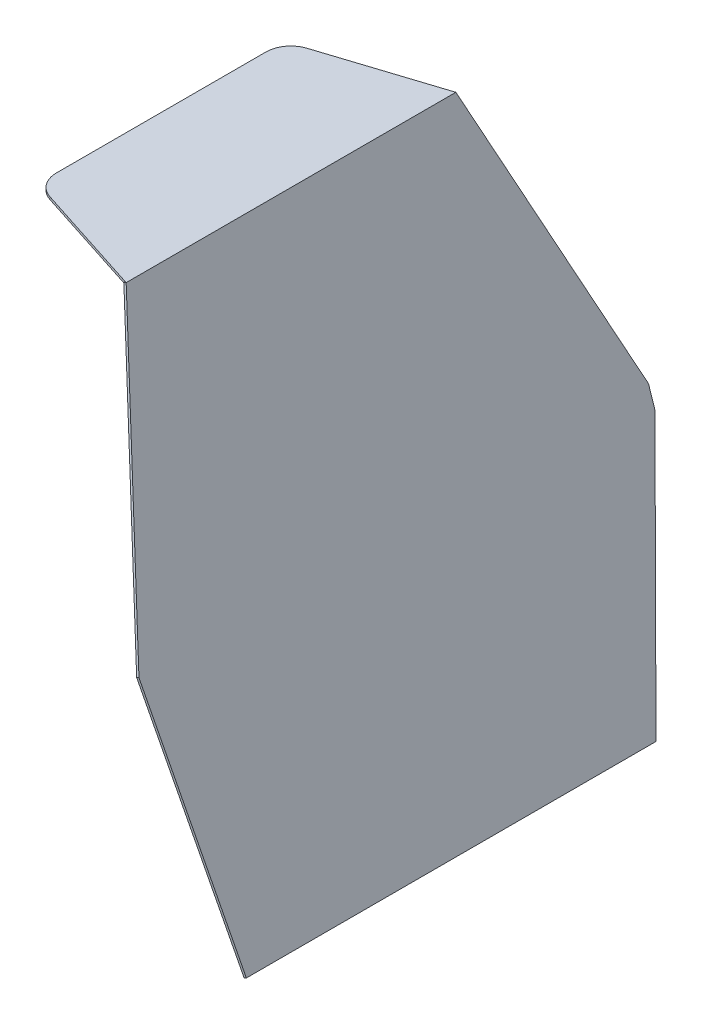
ISO-10303-21;
HEADER;
FILE_DESCRIPTION(('STEP AP214'),'2;1');
FILE_NAME('part.step','',(''),(''),'','','');
FILE_SCHEMA(('AUTOMOTIVE_DESIGN { 1 0 10303 214 1 1 1 1 }'));
ENDSEC;
DATA;
#1=APPLICATION_CONTEXT('core data for automotive mechanical design processes');
#2=APPLICATION_PROTOCOL_DEFINITION('international standard','automotive_design',2000,#1);
#3=PRODUCT_CONTEXT('',#1,'mechanical');
#4=PRODUCT('Part','Part','',(#3));
#5=PRODUCT_RELATED_PRODUCT_CATEGORY('part','',(#4));
#6=PRODUCT_DEFINITION_FORMATION('','',#4);
#7=PRODUCT_DEFINITION_CONTEXT('part definition',#1,'design');
#8=PRODUCT_DEFINITION('design','',#6,#7);
#9=PRODUCT_DEFINITION_SHAPE('','',#8);
#10=(LENGTH_UNIT() NAMED_UNIT(*) SI_UNIT(.MILLI.,.METRE.));
#11=(NAMED_UNIT(*) PLANE_ANGLE_UNIT() SI_UNIT($,.RADIAN.));
#12=(NAMED_UNIT(*) SI_UNIT($,.STERADIAN.) SOLID_ANGLE_UNIT());
#13=UNCERTAINTY_MEASURE_WITH_UNIT(LENGTH_MEASURE(1.E-05),#10,'distance_accuracy_value','');
#14=(GEOMETRIC_REPRESENTATION_CONTEXT(3) GLOBAL_UNCERTAINTY_ASSIGNED_CONTEXT((#13)) GLOBAL_UNIT_ASSIGNED_CONTEXT((#10,
#11,#12)) REPRESENTATION_CONTEXT('',''));
#15=CARTESIAN_POINT('',(0.,0.,0.));
#16=DIRECTION('',(0.,0.,1.));
#17=DIRECTION('',(1.,0.,0.));
#18=AXIS2_PLACEMENT_3D('',#15,#16,#17);
#19=CARTESIAN_POINT('',(2.92969957276702,1.22371786508523,0.));
#20=DIRECTION('',(-0.385422949633144,0.922740022918746,0.));
#21=DIRECTION('',(-0.922740022918746,-0.385422949633144,0.));
#22=AXIS2_PLACEMENT_3D('',#19,#20,#21);
#23=PLANE('',#22);
#24=DIRECTION('',(-0.922740022918746,-0.385422949633144,0.));
#25=VECTOR('',#24,1.);
#26=CARTESIAN_POINT('',(214.132795702549,89.441978978878,-520.7));
#27=LINE('',#26,#25);
#28=CARTESIAN_POINT('',(2.92969957276706,1.22371786508527,-520.7));
#29=VERTEX_POINT('',#28);
#30=CARTESIAN_POINT('',(0.,0.,-520.7));
#31=VERTEX_POINT('',#30);
#32=EDGE_CURVE('E54',#29,#31,#27,.T.);
#33=ORIENTED_EDGE('',*,*,#32,.F.);
#34=DIRECTION('',(0.,0.,-1.));
#35=VECTOR('',#34,1.);
#36=CARTESIAN_POINT('',(2.92969957276702,1.22371786508523,0.));
#37=LINE('',#36,#35);
#38=CARTESIAN_POINT('',(2.92969957276702,1.22371786508523,0.));
#39=VERTEX_POINT('',#38);
#40=EDGE_CURVE('E205',#39,#29,#37,.T.);
#41=ORIENTED_EDGE('',*,*,#40,.F.);
#42=DIRECTION('',(-0.922740022918746,-0.385422949633144,0.));
#43=VECTOR('',#42,1.);
#44=CARTESIAN_POINT('',(2.92969957276702,1.22371786508523,0.));
#45=LINE('',#44,#43);
#46=CARTESIAN_POINT('',(0.,0.,0.));
#47=VERTEX_POINT('',#46);
#48=EDGE_CURVE('E177',#39,#47,#45,.T.);
#49=ORIENTED_EDGE('',*,*,#48,.T.);
#50=DIRECTION('',(0.,0.,-1.));
#51=VECTOR('',#50,1.);
#52=CARTESIAN_POINT('',(0.,0.,0.));
#53=LINE('',#52,#51);
#54=EDGE_CURVE('E151',#47,#31,#53,.T.);
#55=ORIENTED_EDGE('',*,*,#54,.T.);
#56=EDGE_LOOP('',(#33,#41,#49,#55));
#57=FACE_BOUND('',#56,.T.);
#58=ADVANCED_FACE('F39',(#57),#23,.F.);
#59=CARTESIAN_POINT('',(2.92969957276699,1.2237178650853,-609.6));
#60=DIRECTION('',(-0.0240420230429898,0.0575589411964631,0.998052578482889));
#61=DIRECTION('',(0.,-0.998341150201646,0.0575755834886118));
#62=AXIS2_PLACEMENT_3D('',#59,#60,#61);
#63=PLANE('',#62);
#64=DIRECTION('',(-0.922740022918746,-0.385422949633144,0.));
#65=VECTOR('',#64,1.);
#66=CARTESIAN_POINT('',(106.445623575049,347.255541382376,-627.0625));
#67=LINE('',#66,#65);
#68=CARTESIAN_POINT('',(-104.757472554733,259.037280268583,-627.0625));
#69=VERTEX_POINT('',#68);
#70=CARTESIAN_POINT('',(-107.6871721275,257.813562403498,-627.0625));
#71=VERTEX_POINT('',#70);
#72=EDGE_CURVE('E133',#69,#71,#67,.T.);
#73=ORIENTED_EDGE('',*,*,#72,.T.);
#74=DIRECTION('',(-0.384672368687839,0.920943059143414,-0.0623782861551802));
#75=VECTOR('',#74,1.);
#76=CARTESIAN_POINT('',(0.,0.,-609.6));
#77=LINE('',#76,#75);
#78=CARTESIAN_POINT('',(-117.476915048182,281.251158985634,-628.65));
#79=VERTEX_POINT('',#78);
#80=EDGE_CURVE('E142',#71,#79,#77,.T.);
#81=ORIENTED_EDGE('',*,*,#80,.T.);
#82=DIRECTION('',(-0.922740022918746,-0.385422949633144,0.));
#83=VECTOR('',#82,1.);
#84=CARTESIAN_POINT('',(-114.547215475415,282.474876850719,-628.65));
#85=LINE('',#84,#83);
#86=CARTESIAN_POINT('',(-114.547215475415,282.474876850719,-628.65));
#87=VERTEX_POINT('',#86);
#88=EDGE_CURVE('E175',#87,#79,#85,.T.);
#89=ORIENTED_EDGE('',*,*,#88,.F.);
#90=DIRECTION('',(-0.384672368687839,0.920943059143414,-0.0623782861551802));
#91=VECTOR('',#90,1.);
#92=CARTESIAN_POINT('',(2.92969957276699,1.2237178650853,-609.6));
#93=LINE('',#92,#91);
#94=EDGE_CURVE('E144',#69,#87,#93,.T.);
#95=ORIENTED_EDGE('',*,*,#94,.F.);
#96=EDGE_LOOP('',(#73,#81,#89,#95));
#97=FACE_BOUND('',#96,.T.);
#98=ADVANCED_FACE('F140',(#97),#63,.F.);
#99=CARTESIAN_POINT('',(2.92969957276702,1.22371786508523,0.));
#100=DIRECTION('',(0.922740022918746,0.385422949633144,0.));
#101=DIRECTION('',(-0.385422949633144,0.922740022918746,0.));
#102=AXIS2_PLACEMENT_3D('',#99,#100,#101);
#103=PLANE('',#102);
#104=ORIENTED_EDGE('',*,*,#40,.T.);
#105=DIRECTION('',(-0.360205430868089,0.8623668306494,-0.355774502977437));
#106=VECTOR('',#105,1.);
#107=CARTESIAN_POINT('',(69.6583981396342,-158.531275716735,-454.792138728323));
#108=LINE('',#107,#106);
#109=EDGE_CURVE('E145',#29,#69,#108,.T.);
#110=ORIENTED_EDGE('',*,*,#109,.T.);
#111=ORIENTED_EDGE('',*,*,#94,.T.);
#112=DIRECTION('',(-0.365197997434354,0.874319520524673,0.319680776243182));
#113=VECTOR('',#112,1.);
#114=CARTESIAN_POINT('',(-114.547215475415,282.474876850719,-628.65));
#115=LINE('',#114,#113);
#116=CARTESIAN_POINT('',(-245.121632859191,595.082730129796,-514.35));
#117=VERTEX_POINT('',#116);
#118=EDGE_CURVE('E209',#87,#117,#115,.T.);
#119=ORIENTED_EDGE('',*,*,#118,.T.);
#120=DIRECTION('',(0.,0.,1.));
#121=VECTOR('',#120,1.);
#122=CARTESIAN_POINT('',(-245.121632859191,595.082730129796,-514.35));
#123=LINE('',#122,#121);
#124=CARTESIAN_POINT('',(-245.121632859191,595.082730129796,-95.2499999999999));
#125=VERTEX_POINT('',#124);
#126=EDGE_CURVE('E211',#117,#125,#123,.T.);
#127=ORIENTED_EDGE('',*,*,#126,.T.);
#128=DIRECTION('',(0.365197997434354,-0.874319520524673,0.319680776243181));
#129=VECTOR('',#128,1.);
#130=CARTESIAN_POINT('',(-245.121632859191,595.082730129796,-95.2499999999999));
#131=LINE('',#130,#129);
#132=CARTESIAN_POINT('',(-114.547215475415,282.474876850719,19.0499999999999));
#133=VERTEX_POINT('',#132);
#134=EDGE_CURVE('E169',#125,#133,#131,.T.);
#135=ORIENTED_EDGE('',*,*,#134,.T.);
#136=DIRECTION('',(0.384672368687839,-0.920943059143414,-0.0623782861551802));
#137=VECTOR('',#136,1.);
#138=CARTESIAN_POINT('',(-114.547215475415,282.474876850719,19.0499999999999));
#139=LINE('',#138,#137);
#140=EDGE_CURVE('E164',#133,#39,#139,.T.);
#141=ORIENTED_EDGE('',*,*,#140,.T.);
#142=EDGE_LOOP('',(#104,#110,#111,#119,#127,#135,#141));
#143=FACE_BOUND('',#142,.T.);
#144=ADVANCED_FACE('F223',(#143),#103,.T.);
#145=CARTESIAN_POINT('',(0.,0.,0.));
#146=DIRECTION('',(0.922740022918746,0.385422949633144,0.));
#147=DIRECTION('',(-0.385422949633144,0.922740022918746,0.));
#148=AXIS2_PLACEMENT_3D('',#145,#146,#147);
#149=PLANE('',#148);
#150=DIRECTION('',(0.36020543086809,-0.862366830649401,0.355774502977437));
#151=VECTOR('',#150,1.);
#152=CARTESIAN_POINT('',(-107.6871721275,257.813562403498,-627.0625));
#153=LINE('',#152,#151);
#154=EDGE_CURVE('E130',#71,#31,#153,.T.);
#155=ORIENTED_EDGE('',*,*,#154,.T.);
#156=ORIENTED_EDGE('',*,*,#54,.F.);
#157=DIRECTION('',(0.384672368687839,-0.920943059143414,-0.0623782861551802));
#158=VECTOR('',#157,1.);
#159=CARTESIAN_POINT('',(-117.476915048182,281.251158985634,19.0499999999999));
#160=LINE('',#159,#158);
#161=CARTESIAN_POINT('',(-117.476915048182,281.251158985634,19.0499999999999));
#162=VERTEX_POINT('',#161);
#163=EDGE_CURVE('E155',#162,#47,#160,.T.);
#164=ORIENTED_EDGE('',*,*,#163,.F.);
#165=DIRECTION('',(0.365197997434354,-0.874319520524673,0.319680776243181));
#166=VECTOR('',#165,1.);
#167=CARTESIAN_POINT('',(-248.051332431958,593.859012264711,-95.2499999999999));
#168=LINE('',#167,#166);
#169=CARTESIAN_POINT('',(-248.051332431958,593.859012264711,-95.2499999999999));
#170=VERTEX_POINT('',#169);
#171=EDGE_CURVE('E162',#170,#162,#168,.T.);
#172=ORIENTED_EDGE('',*,*,#171,.F.);
#173=DIRECTION('',(0.,0.,1.));
#174=VECTOR('',#173,1.);
#175=CARTESIAN_POINT('',(-248.051332431958,593.859012264711,-514.35));
#176=LINE('',#175,#174);
#177=CARTESIAN_POINT('',(-248.051332431958,593.859012264711,-96.194573447287));
#178=VERTEX_POINT('',#177);
#179=EDGE_CURVE('E153',#178,#170,#176,.T.);
#180=ORIENTED_EDGE('',*,*,#179,.F.);
#181=DIRECTION('',(0.382481147124609,-0.915697061629773,0.123316922670184));
#182=VECTOR('',#181,1.);
#183=CARTESIAN_POINT('',(0.765019197843603,-1.83153035599825,-15.972928475559));
#184=LINE('',#183,#182);
#185=CARTESIAN_POINT('',(-247.236293637362,591.907730129797,-95.9317942834981));
#186=VERTEX_POINT('',#185);
#187=EDGE_CURVE('E11',#178,#186,#184,.T.);
#188=ORIENTED_EDGE('',*,*,#187,.T.);
#189=DIRECTION('',(0.,0.,1.));
#190=VECTOR('',#189,1.);
#191=CARTESIAN_POINT('',(-247.236293637362,591.907730129797,0.));
#192=LINE('',#191,#190);
#193=CARTESIAN_POINT('',(-247.236293637362,591.907730129797,-513.668205716502));
#194=VERTEX_POINT('',#193);
#195=EDGE_CURVE('E61',#194,#186,#192,.T.);
#196=ORIENTED_EDGE('',*,*,#195,.F.);
#197=DIRECTION('',(-0.382481147124609,0.915697061629772,0.123316922670184));
#198=VECTOR('',#197,1.);
#199=CARTESIAN_POINT('',(-27.9876170490282,67.0050769468778,-584.356845665533));
#200=LINE('',#199,#198);
#201=CARTESIAN_POINT('',(-248.051332431958,593.859012264711,-513.405426552713));
#202=VERTEX_POINT('',#201);
#203=EDGE_CURVE('E47',#194,#202,#200,.T.);
#204=ORIENTED_EDGE('',*,*,#203,.T.);
#205=CARTESIAN_POINT('',(-248.051332431958,593.859012264711,-514.35));
#206=VERTEX_POINT('',#205);
#207=EDGE_CURVE('E159',#206,#202,#176,.T.);
#208=ORIENTED_EDGE('',*,*,#207,.F.);
#209=DIRECTION('',(-0.365197997434354,0.874319520524673,0.319680776243182));
#210=VECTOR('',#209,1.);
#211=CARTESIAN_POINT('',(-117.476915048182,281.251158985634,-628.65));
#212=LINE('',#211,#210);
#213=EDGE_CURVE('E150',#79,#206,#212,.T.);
#214=ORIENTED_EDGE('',*,*,#213,.F.);
#215=ORIENTED_EDGE('',*,*,#80,.F.);
#216=EDGE_LOOP('',(#155,#156,#164,#172,#180,#188,#196,#204,#208,#214,#215));
#217=FACE_BOUND('',#216,.T.);
#218=ADVANCED_FACE('F148',(#217),#149,.F.);
#219=CARTESIAN_POINT('',(-245.121632859191,595.082730129796,-514.35));
#220=DIRECTION('',(0.385422949633144,-0.922740022918746,0.));
#221=DIRECTION('',(0.922740022918746,0.385422949633144,0.));
#222=AXIS2_PLACEMENT_3D('',#219,#220,#221);
#223=PLANE('',#222);
#224=DIRECTION('',(-0.922740022918746,-0.385422949633144,0.));
#225=VECTOR('',#224,1.);
#226=CARTESIAN_POINT('',(-245.121632859191,595.082730129796,-95.2499999999999));
#227=LINE('',#226,#225);
#228=EDGE_CURVE('E168',#125,#170,#227,.T.);
#229=ORIENTED_EDGE('',*,*,#228,.F.);
#230=DIRECTION('',(-0.884430040398024,-0.369421100686757,-0.285151808707106));
#231=VECTOR('',#230,1.);
#232=CARTESIAN_POINT('',(-350.817322507712,550.934277200461,-129.327672285144));
#233=LINE('',#232,#231);
#234=EDGE_CURVE('E193',#125,#178,#233,.T.);
#235=ORIENTED_EDGE('',*,*,#234,.T.);
#236=ORIENTED_EDGE('',*,*,#179,.T.);
#237=EDGE_LOOP('',(#229,#235,#236));
#238=FACE_BOUND('',#237,.T.);
#239=ADVANCED_FACE('F230',(#238),#223,.F.);
#240=CARTESIAN_POINT('',(-114.547215475415,282.474876850719,19.0499999999999));
#241=DIRECTION('',(-0.0240420230429898,0.0575589411964631,-0.998052578482889));
#242=DIRECTION('',(0.,0.998341150201646,0.0575755834886118));
#243=AXIS2_PLACEMENT_3D('',#240,#241,#242);
#244=PLANE('',#243);
#245=ORIENTED_EDGE('',*,*,#163,.T.);
#246=ORIENTED_EDGE('',*,*,#48,.F.);
#247=ORIENTED_EDGE('',*,*,#140,.F.);
#248=DIRECTION('',(-0.922740022918746,-0.385422949633144,0.));
#249=VECTOR('',#248,1.);
#250=CARTESIAN_POINT('',(-114.547215475415,282.474876850719,19.0499999999999));
#251=LINE('',#250,#249);
#252=EDGE_CURVE('E165',#133,#162,#251,.T.);
#253=ORIENTED_EDGE('',*,*,#252,.T.);
#254=EDGE_LOOP('',(#245,#246,#247,#253));
#255=FACE_BOUND('',#254,.T.);
#256=ADVANCED_FACE('F41',(#255),#244,.F.);
#257=CARTESIAN_POINT('',(-114.547215475415,282.474876850719,-628.65));
#258=DIRECTION('',(0.12321230772066,-0.294982246797316,0.94752530377851));
#259=DIRECTION('',(0.,-0.95480056522243,-0.297247170972119));
#260=AXIS2_PLACEMENT_3D('',#257,#258,#259);
#261=PLANE('',#260);
#262=ORIENTED_EDGE('',*,*,#213,.T.);
#263=DIRECTION('',(-0.922740022918746,-0.385422949633144,0.));
#264=VECTOR('',#263,1.);
#265=CARTESIAN_POINT('',(-245.121632859191,595.082730129796,-514.35));
#266=LINE('',#265,#264);
#267=EDGE_CURVE('E172',#117,#206,#266,.T.);
#268=ORIENTED_EDGE('',*,*,#267,.F.);
#269=ORIENTED_EDGE('',*,*,#118,.F.);
#270=ORIENTED_EDGE('',*,*,#88,.T.);
#271=EDGE_LOOP('',(#262,#268,#269,#270));
#272=FACE_BOUND('',#271,.T.);
#273=ADVANCED_FACE('F286',(#272),#261,.F.);
#274=ORIENTED_EDGE('',*,*,#207,.T.);
#275=DIRECTION('',(0.884430040398024,0.369421100686757,-0.285151808707107));
#276=VECTOR('',#275,1.);
#277=CARTESIAN_POINT('',(-245.121632859191,595.082730129796,-514.35));
#278=LINE('',#277,#276);
#279=EDGE_CURVE('E185',#202,#117,#278,.T.);
#280=ORIENTED_EDGE('',*,*,#279,.T.);
#281=ORIENTED_EDGE('',*,*,#267,.T.);
#282=EDGE_LOOP('',(#274,#280,#281));
#283=FACE_BOUND('',#282,.T.);
#284=ADVANCED_FACE('F184',(#283),#223,.F.);
#285=CARTESIAN_POINT('',(-245.121632859191,595.082730129796,-95.2499999999999));
#286=DIRECTION('',(0.12321230772066,-0.294982246797316,-0.94752530377851));
#287=DIRECTION('',(0.,0.95480056522243,-0.297247170972119));
#288=AXIS2_PLACEMENT_3D('',#285,#286,#287);
#289=PLANE('',#288);
#290=ORIENTED_EDGE('',*,*,#171,.T.);
#291=ORIENTED_EDGE('',*,*,#252,.F.);
#292=ORIENTED_EDGE('',*,*,#134,.F.);
#293=ORIENTED_EDGE('',*,*,#228,.T.);
#294=EDGE_LOOP('',(#290,#291,#292,#293));
#295=FACE_BOUND('',#294,.T.);
#296=ADVANCED_FACE('F228',(#295),#289,.F.);
#297=CARTESIAN_POINT('',(-245.121632859191,591.907730129797,-95.2499999999999));
#298=DIRECTION('',(-0.306858322026056,0.,0.951755204978335));
#299=DIRECTION('',(0.951755204978335,0.,0.306858322026057));
#300=AXIS2_PLACEMENT_3D('',#297,#298,#299);
#301=PLANE('',#300);
#302=ORIENTED_EDGE('',*,*,#234,.F.);
#303=DIRECTION('',(0.951755204978335,0.,0.306858322026056));
#304=VECTOR('',#303,1.);
#305=CARTESIAN_POINT('',(-245.121632859191,595.082730129796,-95.2499999999999));
#306=LINE('',#305,#304);
#307=CARTESIAN_POINT('',(-388.214384583518,595.082730129796,-141.384974054823));
#308=VERTEX_POINT('',#307);
#309=EDGE_CURVE('E259',#308,#125,#306,.T.);
#310=ORIENTED_EDGE('',*,*,#309,.F.);
#311=DIRECTION('',(0.,1.,0.));
#312=VECTOR('',#311,1.);
#313=CARTESIAN_POINT('',(-388.214384583518,591.907730129797,-141.384974054823));
#314=LINE('',#313,#312);
#315=CARTESIAN_POINT('',(-388.214384583518,591.907730129797,-141.384974054823));
#316=VERTEX_POINT('',#315);
#317=EDGE_CURVE('E194',#316,#308,#314,.T.);
#318=ORIENTED_EDGE('',*,*,#317,.F.);
#319=DIRECTION('',(0.951755204978335,0.,0.306858322026056));
#320=VECTOR('',#319,1.);
#321=CARTESIAN_POINT('',(-245.121632859191,591.907730129797,-95.2499999999999));
#322=LINE('',#321,#320);
#323=EDGE_CURVE('E238',#316,#186,#322,.T.);
#324=ORIENTED_EDGE('',*,*,#323,.T.);
#325=ORIENTED_EDGE('',*,*,#187,.F.);
#326=EDGE_LOOP('',(#302,#310,#318,#324,#325));
#327=FACE_BOUND('',#326,.T.);
#328=ADVANCED_FACE('F234',(#327),#301,.T.);
#329=CARTESIAN_POINT('',(-245.121632859191,591.907730129797,-514.35));
#330=DIRECTION('',(-0.306858322026057,0.,-0.951755204978335));
#331=DIRECTION('',(-0.951755204978335,0.,0.306858322026057));
#332=AXIS2_PLACEMENT_3D('',#329,#330,#331);
#333=PLANE('',#332);
#334=ORIENTED_EDGE('',*,*,#279,.F.);
#335=ORIENTED_EDGE('',*,*,#203,.F.);
#336=DIRECTION('',(-0.951755204978335,0.,0.306858322026057));
#337=VECTOR('',#336,1.);
#338=CARTESIAN_POINT('',(-245.121632859191,591.907730129797,-514.35));
#339=LINE('',#338,#337);
#340=CARTESIAN_POINT('',(-388.214384583518,591.907730129797,-468.215025945177));
#341=VERTEX_POINT('',#340);
#342=EDGE_CURVE('E260',#194,#341,#339,.T.);
#343=ORIENTED_EDGE('',*,*,#342,.T.);
#344=DIRECTION('',(0.,1.,0.));
#345=VECTOR('',#344,1.);
#346=CARTESIAN_POINT('',(-388.214384583518,591.907730129797,-468.215025945177));
#347=LINE('',#346,#345);
#348=CARTESIAN_POINT('',(-388.214384583518,595.082730129796,-468.215025945177));
#349=VERTEX_POINT('',#348);
#350=EDGE_CURVE('E200',#341,#349,#347,.T.);
#351=ORIENTED_EDGE('',*,*,#350,.T.);
#352=DIRECTION('',(-0.951755204978335,0.,0.306858322026057));
#353=VECTOR('',#352,1.);
#354=CARTESIAN_POINT('',(-245.121632859191,595.082730129796,-514.35));
#355=LINE('',#354,#353);
#356=EDGE_CURVE('E191',#117,#349,#355,.T.);
#357=ORIENTED_EDGE('',*,*,#356,.F.);
#358=EDGE_LOOP('',(#334,#335,#343,#351,#357));
#359=FACE_BOUND('',#358,.T.);
#360=ADVANCED_FACE('F189',(#359),#333,.T.);
#361=CARTESIAN_POINT('',(-378.471632859191,591.907730129797,-171.603201812885));
#362=DIRECTION('',(0.,1.,0.));
#363=DIRECTION('',(0.,0.,1.));
#364=AXIS2_PLACEMENT_3D('',#361,#362,#363);
#365=PLANE('',#364);
#366=ORIENTED_EDGE('',*,*,#342,.F.);
#367=ORIENTED_EDGE('',*,*,#195,.T.);
#368=ORIENTED_EDGE('',*,*,#323,.F.);
#369=CARTESIAN_POINT('',(-378.471632859191,591.907730129797,-171.603201812885));
#370=DIRECTION('',(0.,1.,0.));
#371=DIRECTION('',(0.,0.,1.));
#372=AXIS2_PLACEMENT_3D('',#369,#370,#371);
#373=CIRCLE('',#372,31.75);
#374=CARTESIAN_POINT('',(-410.221632859191,591.907730129797,-171.603201812885));
#375=VERTEX_POINT('',#374);
#376=EDGE_CURVE('E242',#375,#316,#373,.T.);
#377=ORIENTED_EDGE('',*,*,#376,.F.);
#378=DIRECTION('',(0.,0.,1.));
#379=VECTOR('',#378,1.);
#380=CARTESIAN_POINT('',(-410.221632859191,591.907730129797,-437.996798187115));
#381=LINE('',#380,#379);
#382=CARTESIAN_POINT('',(-410.221632859191,591.907730129797,-437.996798187115));
#383=VERTEX_POINT('',#382);
#384=EDGE_CURVE('E245',#383,#375,#381,.T.);
#385=ORIENTED_EDGE('',*,*,#384,.F.);
#386=CARTESIAN_POINT('',(-378.471632859191,591.907730129797,-437.996798187115));
#387=DIRECTION('',(0.,1.,0.));
#388=DIRECTION('',(0.,0.,1.));
#389=AXIS2_PLACEMENT_3D('',#386,#387,#388);
#390=CIRCLE('',#389,31.75);
#391=EDGE_CURVE('E269',#341,#383,#390,.T.);
#392=ORIENTED_EDGE('',*,*,#391,.F.);
#393=EDGE_LOOP('',(#366,#367,#368,#377,#385,#392));
#394=FACE_BOUND('',#393,.T.);
#395=ADVANCED_FACE('F279',(#394),#365,.F.);
#396=CARTESIAN_POINT('',(-378.471632859191,591.907730129797,-171.603201812885));
#397=DIRECTION('',(0.,1.,0.));
#398=DIRECTION('',(0.,0.,1.));
#399=AXIS2_PLACEMENT_3D('',#396,#397,#398);
#400=CYLINDRICAL_SURFACE('',#399,31.75);
#401=CARTESIAN_POINT('',(-378.471632859191,595.082730129796,-171.603201812885));
#402=DIRECTION('',(0.,1.,0.));
#403=DIRECTION('',(0.,0.,1.));
#404=AXIS2_PLACEMENT_3D('',#401,#402,#403);
#405=CIRCLE('',#404,31.75);
#406=CARTESIAN_POINT('',(-410.221632859191,595.082730129796,-171.603201812885));
#407=VERTEX_POINT('',#406);
#408=EDGE_CURVE('E256',#407,#308,#405,.T.);
#409=ORIENTED_EDGE('',*,*,#408,.F.);
#410=DIRECTION('',(0.,1.,0.));
#411=VECTOR('',#410,1.);
#412=CARTESIAN_POINT('',(-410.221632859191,591.907730129797,-171.603201812885));
#413=LINE('',#412,#411);
#414=EDGE_CURVE('E197',#375,#407,#413,.T.);
#415=ORIENTED_EDGE('',*,*,#414,.F.);
#416=ORIENTED_EDGE('',*,*,#376,.T.);
#417=ORIENTED_EDGE('',*,*,#317,.T.);
#418=EDGE_LOOP('',(#409,#415,#416,#417));
#419=FACE_BOUND('',#418,.T.);
#420=ADVANCED_FACE('F278',(#419),#400,.T.);
#421=CARTESIAN_POINT('',(-410.221632859191,591.907730129797,-437.996798187115));
#422=DIRECTION('',(-1.,0.,0.));
#423=DIRECTION('',(0.,0.,1.));
#424=AXIS2_PLACEMENT_3D('',#421,#422,#423);
#425=PLANE('',#424);
#426=DIRECTION('',(0.,0.,1.));
#427=VECTOR('',#426,1.);
#428=CARTESIAN_POINT('',(-410.221632859191,595.082730129796,-437.996798187115));
#429=LINE('',#428,#427);
#430=CARTESIAN_POINT('',(-410.221632859191,595.082730129796,-437.996798187115));
#431=VERTEX_POINT('',#430);
#432=EDGE_CURVE('E253',#431,#407,#429,.T.);
#433=ORIENTED_EDGE('',*,*,#432,.F.);
#434=DIRECTION('',(0.,1.,0.));
#435=VECTOR('',#434,1.);
#436=CARTESIAN_POINT('',(-410.221632859191,591.907730129797,-437.996798187115));
#437=LINE('',#436,#435);
#438=EDGE_CURVE('E244',#383,#431,#437,.T.);
#439=ORIENTED_EDGE('',*,*,#438,.F.);
#440=ORIENTED_EDGE('',*,*,#384,.T.);
#441=ORIENTED_EDGE('',*,*,#414,.T.);
#442=EDGE_LOOP('',(#433,#439,#440,#441));
#443=FACE_BOUND('',#442,.T.);
#444=ADVANCED_FACE('F273',(#443),#425,.T.);
#445=CARTESIAN_POINT('',(-378.471632859191,591.907730129797,-437.996798187115));
#446=DIRECTION('',(0.,1.,0.));
#447=DIRECTION('',(0.,0.,1.));
#448=AXIS2_PLACEMENT_3D('',#445,#446,#447);
#449=CYLINDRICAL_SURFACE('',#448,31.75);
#450=CARTESIAN_POINT('',(-378.471632859191,595.082730129796,-437.996798187115));
#451=DIRECTION('',(0.,1.,0.));
#452=DIRECTION('',(0.,0.,1.));
#453=AXIS2_PLACEMENT_3D('',#450,#451,#452);
#454=CIRCLE('',#453,31.75);
#455=EDGE_CURVE('E250',#349,#431,#454,.T.);
#456=ORIENTED_EDGE('',*,*,#455,.F.);
#457=ORIENTED_EDGE('',*,*,#350,.F.);
#458=ORIENTED_EDGE('',*,*,#391,.T.);
#459=ORIENTED_EDGE('',*,*,#438,.T.);
#460=EDGE_LOOP('',(#456,#457,#458,#459));
#461=FACE_BOUND('',#460,.T.);
#462=ADVANCED_FACE('F266',(#461),#449,.T.);
#463=CARTESIAN_POINT('',(-378.471632859191,595.082730129796,-171.603201812885));
#464=DIRECTION('',(0.,1.,0.));
#465=DIRECTION('',(0.,0.,1.));
#466=AXIS2_PLACEMENT_3D('',#463,#464,#465);
#467=PLANE('',#466);
#468=ORIENTED_EDGE('',*,*,#126,.F.);
#469=ORIENTED_EDGE('',*,*,#356,.T.);
#470=ORIENTED_EDGE('',*,*,#455,.T.);
#471=ORIENTED_EDGE('',*,*,#432,.T.);
#472=ORIENTED_EDGE('',*,*,#408,.T.);
#473=ORIENTED_EDGE('',*,*,#309,.T.);
#474=EDGE_LOOP('',(#468,#469,#470,#471,#472,#473));
#475=FACE_BOUND('',#474,.T.);
#476=ADVANCED_FACE('F276',(#475),#467,.T.);
#477=CARTESIAN_POINT('',(106.445623575049,347.255541382376,-627.0625));
#478=DIRECTION('',(0.137123658341829,-0.328287373031306,-0.93457182871685));
#479=DIRECTION('',(0.,0.943484038278699,-0.331417968000106));
#480=AXIS2_PLACEMENT_3D('',#477,#478,#479);
#481=PLANE('',#480);
#482=ORIENTED_EDGE('',*,*,#32,.T.);
#483=ORIENTED_EDGE('',*,*,#154,.F.);
#484=ORIENTED_EDGE('',*,*,#72,.F.);
#485=ORIENTED_EDGE('',*,*,#109,.F.);
#486=EDGE_LOOP('',(#482,#483,#484,#485));
#487=FACE_BOUND('',#486,.T.);
#488=ADVANCED_FACE('F132',(#487),#481,.T.);
#489=CLOSED_SHELL('',(#58,#98,#144,#218,#239,#256,#273,#284,#296,#328,#360,#395,#420,#444,#462,
#476,#488));
#490=MANIFOLD_SOLID_BREP('B2',#489);
#491=ADVANCED_BREP_SHAPE_REPRESENTATION('',(#18,#490),#14);
#492=SHAPE_DEFINITION_REPRESENTATION(#9,#491);
ENDSEC;
END-ISO-10303-21;
